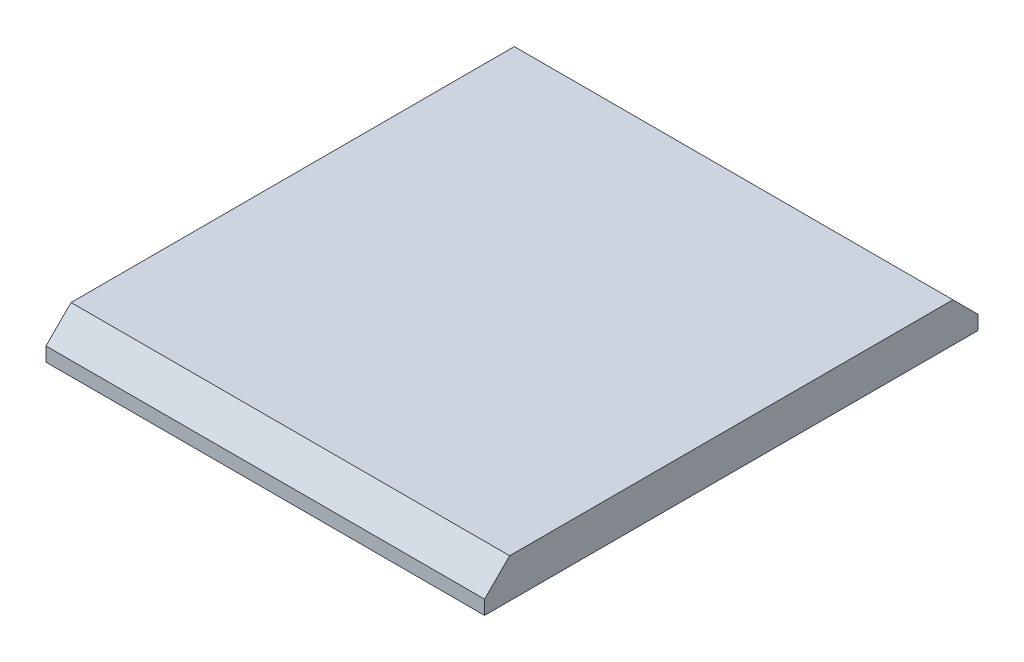
ISO-10303-21;
HEADER;
FILE_DESCRIPTION(('STEP AP214'),'2;1');
FILE_NAME('part.step','',(''),(''),'','','');
FILE_SCHEMA(('AUTOMOTIVE_DESIGN { 1 0 10303 214 1 1 1 1 }'));
ENDSEC;
DATA;
#1=APPLICATION_CONTEXT('core data for automotive mechanical design processes');
#2=APPLICATION_PROTOCOL_DEFINITION('international standard','automotive_design',2000,#1);
#3=PRODUCT_CONTEXT('',#1,'mechanical');
#4=PRODUCT('Part','Part','',(#3));
#5=PRODUCT_RELATED_PRODUCT_CATEGORY('part','',(#4));
#6=PRODUCT_DEFINITION_FORMATION('','',#4);
#7=PRODUCT_DEFINITION_CONTEXT('part definition',#1,'design');
#8=PRODUCT_DEFINITION('design','',#6,#7);
#9=PRODUCT_DEFINITION_SHAPE('','',#8);
#10=(LENGTH_UNIT() NAMED_UNIT(*) SI_UNIT(.MILLI.,.METRE.));
#11=(NAMED_UNIT(*) PLANE_ANGLE_UNIT() SI_UNIT($,.RADIAN.));
#12=(NAMED_UNIT(*) SI_UNIT($,.STERADIAN.) SOLID_ANGLE_UNIT());
#13=UNCERTAINTY_MEASURE_WITH_UNIT(LENGTH_MEASURE(1.E-05),#10,'distance_accuracy_value','');
#14=(GEOMETRIC_REPRESENTATION_CONTEXT(3) GLOBAL_UNCERTAINTY_ASSIGNED_CONTEXT((#13)) GLOBAL_UNIT_ASSIGNED_CONTEXT((#10,
#11,#12)) REPRESENTATION_CONTEXT('',''));
#15=CARTESIAN_POINT('',(0.,0.,0.));
#16=DIRECTION('',(0.,0.,1.));
#17=DIRECTION('',(1.,0.,0.));
#18=AXIS2_PLACEMENT_3D('',#15,#16,#17);
#19=CARTESIAN_POINT('',(0.,31.75,0.));
#20=DIRECTION('',(1.,0.,0.));
#21=DIRECTION('',(0.,0.,-1.));
#22=AXIS2_PLACEMENT_3D('',#19,#20,#21);
#23=PLANE('',#22);
#24=DIRECTION('',(0.,-1.,0.));
#25=VECTOR('',#24,1.);
#26=CARTESIAN_POINT('',(0.,31.75,0.));
#27=LINE('',#26,#25);
#28=CARTESIAN_POINT('',(0.,11.43,0.));
#29=VERTEX_POINT('',#28);
#30=CARTESIAN_POINT('',(0.,0.,0.));
#31=VERTEX_POINT('',#30);
#32=EDGE_CURVE('E105',#29,#31,#27,.T.);
#33=ORIENTED_EDGE('',*,*,#32,.F.);
#34=DIRECTION('',(0.,0.707106781186548,-0.707106781186548));
#35=VECTOR('',#34,1.);
#36=CARTESIAN_POINT('',(0.,21.59,-10.16));
#37=LINE('',#36,#35);
#38=CARTESIAN_POINT('',(0.,31.75,-20.32));
#39=VERTEX_POINT('',#38);
#40=EDGE_CURVE('E85',#29,#39,#37,.T.);
#41=ORIENTED_EDGE('',*,*,#40,.T.);
#42=DIRECTION('',(0.,0.,1.));
#43=VECTOR('',#42,1.);
#44=CARTESIAN_POINT('',(0.,31.75,0.));
#45=LINE('',#44,#43);
#46=CARTESIAN_POINT('',(0.,31.75,-379.73));
#47=VERTEX_POINT('',#46);
#48=EDGE_CURVE('E116',#47,#39,#45,.T.);
#49=ORIENTED_EDGE('',*,*,#48,.F.);
#50=DIRECTION('',(0.,-0.707106781186547,-0.707106781186548));
#51=VECTOR('',#50,1.);
#52=CARTESIAN_POINT('',(0.,221.615,-189.865));
#53=LINE('',#52,#51);
#54=CARTESIAN_POINT('',(0.,11.43,-400.05));
#55=VERTEX_POINT('',#54);
#56=EDGE_CURVE('E54',#47,#55,#53,.T.);
#57=ORIENTED_EDGE('',*,*,#56,.T.);
#58=DIRECTION('',(0.,-1.,0.));
#59=VECTOR('',#58,1.);
#60=CARTESIAN_POINT('',(0.,31.75,-400.05));
#61=LINE('',#60,#59);
#62=CARTESIAN_POINT('',(0.,0.,-400.05));
#63=VERTEX_POINT('',#62);
#64=EDGE_CURVE('E109',#55,#63,#61,.T.);
#65=ORIENTED_EDGE('',*,*,#64,.T.);
#66=DIRECTION('',(0.,0.,1.));
#67=VECTOR('',#66,1.);
#68=CARTESIAN_POINT('',(0.,0.,0.));
#69=LINE('',#68,#67);
#70=EDGE_CURVE('E128',#63,#31,#69,.T.);
#71=ORIENTED_EDGE('',*,*,#70,.T.);
#72=EDGE_LOOP('',(#33,#41,#49,#57,#65,#71));
#73=FACE_BOUND('',#72,.T.);
#74=ADVANCED_FACE('F33',(#73),#23,.F.);
#75=CARTESIAN_POINT('',(0.,31.75,0.));
#76=DIRECTION('',(0.,0.,-1.));
#77=DIRECTION('',(-1.,0.,0.));
#78=AXIS2_PLACEMENT_3D('',#75,#76,#77);
#79=PLANE('',#78);
#80=DIRECTION('',(0.,-1.,0.));
#81=VECTOR('',#80,1.);
#82=CARTESIAN_POINT('',(355.6,31.75,0.));
#83=LINE('',#82,#81);
#84=CARTESIAN_POINT('',(355.6,11.43,0.));
#85=VERTEX_POINT('',#84);
#86=CARTESIAN_POINT('',(355.6,0.,0.));
#87=VERTEX_POINT('',#86);
#88=EDGE_CURVE('E94',#85,#87,#83,.T.);
#89=ORIENTED_EDGE('',*,*,#88,.F.);
#90=DIRECTION('',(1.,0.,0.));
#91=VECTOR('',#90,1.);
#92=CARTESIAN_POINT('',(-13.9700000000001,11.43,0.));
#93=LINE('',#92,#91);
#94=EDGE_CURVE('E82',#29,#85,#93,.T.);
#95=ORIENTED_EDGE('',*,*,#94,.F.);
#96=ORIENTED_EDGE('',*,*,#32,.T.);
#97=DIRECTION('',(1.,0.,0.));
#98=VECTOR('',#97,1.);
#99=CARTESIAN_POINT('',(0.,0.,0.));
#100=LINE('',#99,#98);
#101=EDGE_CURVE('E103',#31,#87,#100,.T.);
#102=ORIENTED_EDGE('',*,*,#101,.T.);
#103=EDGE_LOOP('',(#89,#95,#96,#102));
#104=FACE_BOUND('',#103,.T.);
#105=ADVANCED_FACE('F101',(#104),#79,.F.);
#106=CARTESIAN_POINT('',(355.6,31.75,0.));
#107=DIRECTION('',(-1.,0.,0.));
#108=DIRECTION('',(0.,0.,1.));
#109=AXIS2_PLACEMENT_3D('',#106,#107,#108);
#110=PLANE('',#109);
#111=DIRECTION('',(0.,0.,-1.));
#112=VECTOR('',#111,1.);
#113=CARTESIAN_POINT('',(355.6,31.75,0.));
#114=LINE('',#113,#112);
#115=CARTESIAN_POINT('',(355.6,31.75,-20.32));
#116=VERTEX_POINT('',#115);
#117=CARTESIAN_POINT('',(355.6,31.75,-379.73));
#118=VERTEX_POINT('',#117);
#119=EDGE_CURVE('E98',#116,#118,#114,.T.);
#120=ORIENTED_EDGE('',*,*,#119,.F.);
#121=DIRECTION('',(0.,0.707106781186548,-0.707106781186548));
#122=VECTOR('',#121,1.);
#123=CARTESIAN_POINT('',(355.6,31.75,-20.32));
#124=LINE('',#123,#122);
#125=EDGE_CURVE('E47',#85,#116,#124,.T.);
#126=ORIENTED_EDGE('',*,*,#125,.F.);
#127=ORIENTED_EDGE('',*,*,#88,.T.);
#128=DIRECTION('',(0.,0.,-1.));
#129=VECTOR('',#128,1.);
#130=CARTESIAN_POINT('',(355.6,0.,0.));
#131=LINE('',#130,#129);
#132=CARTESIAN_POINT('',(355.6,0.,-400.05));
#133=VERTEX_POINT('',#132);
#134=EDGE_CURVE('E123',#87,#133,#131,.T.);
#135=ORIENTED_EDGE('',*,*,#134,.T.);
#136=DIRECTION('',(0.,-1.,0.));
#137=VECTOR('',#136,1.);
#138=CARTESIAN_POINT('',(355.6,31.75,-400.05));
#139=LINE('',#138,#137);
#140=CARTESIAN_POINT('',(355.6,11.43,-400.05));
#141=VERTEX_POINT('',#140);
#142=EDGE_CURVE('E106',#141,#133,#139,.T.);
#143=ORIENTED_EDGE('',*,*,#142,.F.);
#144=DIRECTION('',(0.,-0.707106781186547,-0.707106781186548));
#145=VECTOR('',#144,1.);
#146=CARTESIAN_POINT('',(355.6,31.75,-379.73));
#147=LINE('',#146,#145);
#148=EDGE_CURVE('E140',#118,#141,#147,.T.);
#149=ORIENTED_EDGE('',*,*,#148,.F.);
#150=EDGE_LOOP('',(#120,#126,#127,#135,#143,#149));
#151=FACE_BOUND('',#150,.T.);
#152=ADVANCED_FACE('F92',(#151),#110,.F.);
#153=CARTESIAN_POINT('',(0.,31.75,-400.05));
#154=DIRECTION('',(0.,0.,1.));
#155=DIRECTION('',(1.,0.,0.));
#156=AXIS2_PLACEMENT_3D('',#153,#154,#155);
#157=PLANE('',#156);
#158=ORIENTED_EDGE('',*,*,#64,.F.);
#159=DIRECTION('',(1.,0.,0.));
#160=VECTOR('',#159,1.);
#161=CARTESIAN_POINT('',(-13.9700000000001,11.43,-400.05));
#162=LINE('',#161,#160);
#163=EDGE_CURVE('E99',#55,#141,#162,.T.);
#164=ORIENTED_EDGE('',*,*,#163,.T.);
#165=ORIENTED_EDGE('',*,*,#142,.T.);
#166=DIRECTION('',(-1.,0.,0.));
#167=VECTOR('',#166,1.);
#168=CARTESIAN_POINT('',(0.,0.,-400.05));
#169=LINE('',#168,#167);
#170=EDGE_CURVE('E119',#133,#63,#169,.T.);
#171=ORIENTED_EDGE('',*,*,#170,.T.);
#172=EDGE_LOOP('',(#158,#164,#165,#171));
#173=FACE_BOUND('',#172,.T.);
#174=ADVANCED_FACE('F136',(#173),#157,.F.);
#175=CARTESIAN_POINT('',(0.,31.75,0.));
#176=DIRECTION('',(0.,-1.,0.));
#177=DIRECTION('',(0.,0.,-1.));
#178=AXIS2_PLACEMENT_3D('',#175,#176,#177);
#179=PLANE('',#178);
#180=ORIENTED_EDGE('',*,*,#48,.T.);
#181=DIRECTION('',(1.,0.,0.));
#182=VECTOR('',#181,1.);
#183=CARTESIAN_POINT('',(0.,31.75,-20.32));
#184=LINE('',#183,#182);
#185=EDGE_CURVE('E11',#39,#116,#184,.T.);
#186=ORIENTED_EDGE('',*,*,#185,.T.);
#187=ORIENTED_EDGE('',*,*,#119,.T.);
#188=DIRECTION('',(-1.,0.,0.));
#189=VECTOR('',#188,1.);
#190=CARTESIAN_POINT('',(0.,31.75,-379.73));
#191=LINE('',#190,#189);
#192=EDGE_CURVE('E40',#118,#47,#191,.T.);
#193=ORIENTED_EDGE('',*,*,#192,.T.);
#194=EDGE_LOOP('',(#180,#186,#187,#193));
#195=FACE_BOUND('',#194,.T.);
#196=ADVANCED_FACE('F115',(#195),#179,.F.);
#197=CARTESIAN_POINT('',(0.,0.,0.));
#198=DIRECTION('',(0.,-1.,0.));
#199=DIRECTION('',(0.,0.,-1.));
#200=AXIS2_PLACEMENT_3D('',#197,#198,#199);
#201=PLANE('',#200);
#202=ORIENTED_EDGE('',*,*,#70,.F.);
#203=ORIENTED_EDGE('',*,*,#170,.F.);
#204=ORIENTED_EDGE('',*,*,#134,.F.);
#205=ORIENTED_EDGE('',*,*,#101,.F.);
#206=EDGE_LOOP('',(#202,#203,#204,#205));
#207=FACE_BOUND('',#206,.T.);
#208=ADVANCED_FACE('F139',(#207),#201,.T.);
#209=CARTESIAN_POINT('',(-13.9700000000001,31.75,-379.73));
#210=DIRECTION('',(0.,-0.707106781186548,0.707106781186547));
#211=DIRECTION('',(0.,-0.707106781186547,-0.707106781186548));
#212=AXIS2_PLACEMENT_3D('',#209,#210,#211);
#213=PLANE('',#212);
#214=ORIENTED_EDGE('',*,*,#192,.F.);
#215=ORIENTED_EDGE('',*,*,#148,.T.);
#216=ORIENTED_EDGE('',*,*,#163,.F.);
#217=ORIENTED_EDGE('',*,*,#56,.F.);
#218=EDGE_LOOP('',(#214,#215,#216,#217));
#219=FACE_BOUND('',#218,.T.);
#220=ADVANCED_FACE('F143',(#219),#213,.F.);
#221=CARTESIAN_POINT('',(-13.9700000000001,31.75,-20.32));
#222=DIRECTION('',(0.,-0.707106781186547,-0.707106781186547));
#223=DIRECTION('',(0.,0.707106781186548,-0.707106781186548));
#224=AXIS2_PLACEMENT_3D('',#221,#222,#223);
#225=PLANE('',#224);
#226=ORIENTED_EDGE('',*,*,#94,.T.);
#227=ORIENTED_EDGE('',*,*,#125,.T.);
#228=ORIENTED_EDGE('',*,*,#185,.F.);
#229=ORIENTED_EDGE('',*,*,#40,.F.);
#230=EDGE_LOOP('',(#226,#227,#228,#229));
#231=FACE_BOUND('',#230,.T.);
#232=ADVANCED_FACE('F83',(#231),#225,.F.);
#233=CLOSED_SHELL('',(#74,#105,#152,#174,#196,#208,#220,#232));
#234=MANIFOLD_SOLID_BREP('B2',#233);
#235=ADVANCED_BREP_SHAPE_REPRESENTATION('',(#18,#234),#14);
#236=SHAPE_DEFINITION_REPRESENTATION(#9,#235);
ENDSEC;
END-ISO-10303-21;
